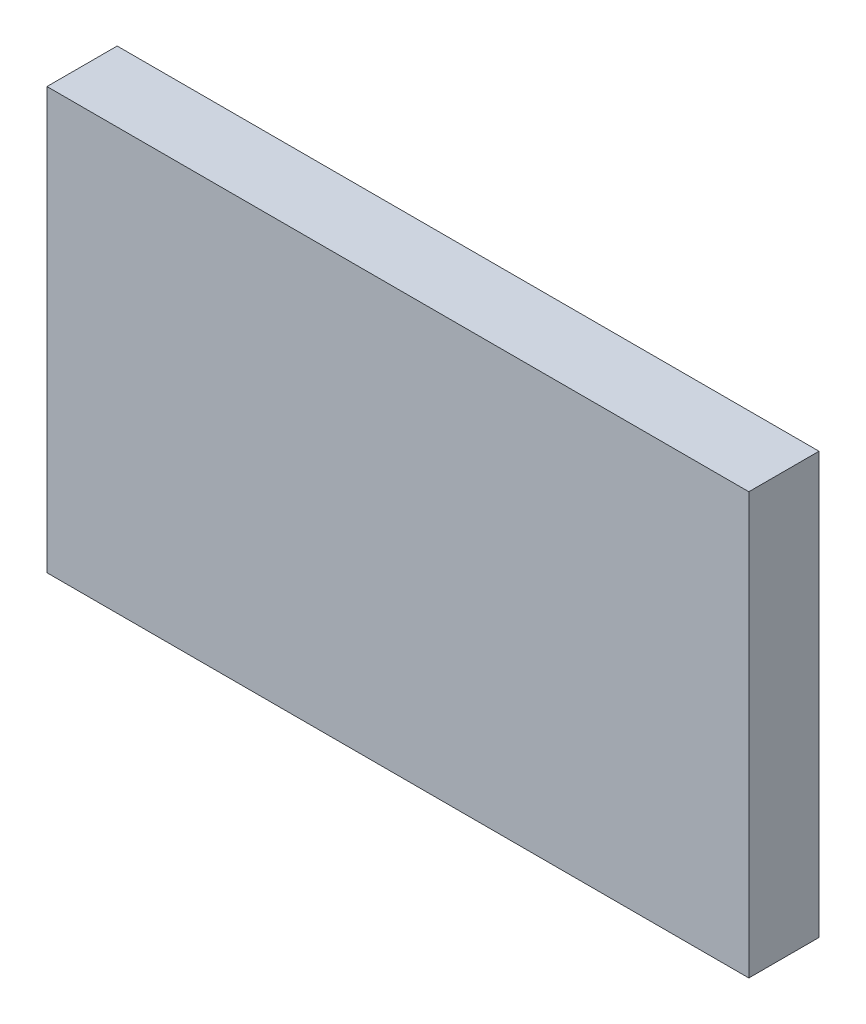
ISO-10303-21;
HEADER;
FILE_DESCRIPTION(('STEP AP214'),'2;1');
FILE_NAME('part.step','',(''),(''),'','','');
FILE_SCHEMA(('AUTOMOTIVE_DESIGN { 1 0 10303 214 1 1 1 1 }'));
ENDSEC;
DATA;
#1=APPLICATION_CONTEXT('core data for automotive mechanical design processes');
#2=APPLICATION_PROTOCOL_DEFINITION('international standard','automotive_design',2000,#1);
#3=PRODUCT_CONTEXT('',#1,'mechanical');
#4=PRODUCT('Part','Part','',(#3));
#5=PRODUCT_RELATED_PRODUCT_CATEGORY('part','',(#4));
#6=PRODUCT_DEFINITION_FORMATION('','',#4);
#7=PRODUCT_DEFINITION_CONTEXT('part definition',#1,'design');
#8=PRODUCT_DEFINITION('design','',#6,#7);
#9=PRODUCT_DEFINITION_SHAPE('','',#8);
#10=(LENGTH_UNIT() NAMED_UNIT(*) SI_UNIT(.MILLI.,.METRE.));
#11=(NAMED_UNIT(*) PLANE_ANGLE_UNIT() SI_UNIT($,.RADIAN.));
#12=(NAMED_UNIT(*) SI_UNIT($,.STERADIAN.) SOLID_ANGLE_UNIT());
#13=UNCERTAINTY_MEASURE_WITH_UNIT(LENGTH_MEASURE(1.E-05),#10,'distance_accuracy_value','');
#14=(GEOMETRIC_REPRESENTATION_CONTEXT(3) GLOBAL_UNCERTAINTY_ASSIGNED_CONTEXT((#13)) GLOBAL_UNIT_ASSIGNED_CONTEXT((#10,
#11,#12)) REPRESENTATION_CONTEXT('',''));
#15=CARTESIAN_POINT('',(0.,0.,0.));
#16=DIRECTION('',(0.,0.,1.));
#17=DIRECTION('',(1.,0.,0.));
#18=AXIS2_PLACEMENT_3D('',#15,#16,#17);
#19=CARTESIAN_POINT('',(-50.,30.,10.));
#20=DIRECTION('',(1.,0.,0.));
#21=DIRECTION('',(0.,0.,-1.));
#22=AXIS2_PLACEMENT_3D('',#19,#20,#21);
#23=PLANE('',#22);
#24=DIRECTION('',(0.,-1.,0.));
#25=VECTOR('',#24,1.);
#26=CARTESIAN_POINT('',(-50.,30.,0.));
#27=LINE('',#26,#25);
#28=CARTESIAN_POINT('',(-50.,30.,0.));
#29=VERTEX_POINT('',#28);
#30=CARTESIAN_POINT('',(-50.,-30.,0.));
#31=VERTEX_POINT('',#30);
#32=EDGE_CURVE('E104',#29,#31,#27,.T.);
#33=ORIENTED_EDGE('',*,*,#32,.T.);
#34=DIRECTION('',(0.,0.,-1.));
#35=VECTOR('',#34,1.);
#36=CARTESIAN_POINT('',(-50.,-30.,10.));
#37=LINE('',#36,#35);
#38=CARTESIAN_POINT('',(-50.,-30.,10.));
#39=VERTEX_POINT('',#38);
#40=EDGE_CURVE('E11',#39,#31,#37,.T.);
#41=ORIENTED_EDGE('',*,*,#40,.F.);
#42=DIRECTION('',(0.,-1.,0.));
#43=VECTOR('',#42,1.);
#44=CARTESIAN_POINT('',(-50.,30.,10.));
#45=LINE('',#44,#43);
#46=CARTESIAN_POINT('',(-50.,30.,10.));
#47=VERTEX_POINT('',#46);
#48=EDGE_CURVE('E92',#47,#39,#45,.T.);
#49=ORIENTED_EDGE('',*,*,#48,.F.);
#50=DIRECTION('',(0.,0.,-1.));
#51=VECTOR('',#50,1.);
#52=CARTESIAN_POINT('',(-50.,30.,10.));
#53=LINE('',#52,#51);
#54=EDGE_CURVE('E100',#47,#29,#53,.T.);
#55=ORIENTED_EDGE('',*,*,#54,.T.);
#56=EDGE_LOOP('',(#33,#41,#49,#55));
#57=FACE_BOUND('',#56,.T.);
#58=ADVANCED_FACE('F41',(#57),#23,.F.);
#59=CARTESIAN_POINT('',(-50.,-30.,10.));
#60=DIRECTION('',(0.,1.,0.));
#61=DIRECTION('',(0.,0.,1.));
#62=AXIS2_PLACEMENT_3D('',#59,#60,#61);
#63=PLANE('',#62);
#64=DIRECTION('',(1.,0.,0.));
#65=VECTOR('',#64,1.);
#66=CARTESIAN_POINT('',(-50.,-30.,0.));
#67=LINE('',#66,#65);
#68=CARTESIAN_POINT('',(50.,-30.,0.));
#69=VERTEX_POINT('',#68);
#70=EDGE_CURVE('E96',#31,#69,#67,.T.);
#71=ORIENTED_EDGE('',*,*,#70,.T.);
#72=DIRECTION('',(0.,0.,-1.));
#73=VECTOR('',#72,1.);
#74=CARTESIAN_POINT('',(50.,-30.,10.));
#75=LINE('',#74,#73);
#76=CARTESIAN_POINT('',(50.,-30.,10.));
#77=VERTEX_POINT('',#76);
#78=EDGE_CURVE('E49',#77,#69,#75,.T.);
#79=ORIENTED_EDGE('',*,*,#78,.F.);
#80=DIRECTION('',(1.,0.,0.));
#81=VECTOR('',#80,1.);
#82=CARTESIAN_POINT('',(-50.,-30.,10.));
#83=LINE('',#82,#81);
#84=EDGE_CURVE('E87',#39,#77,#83,.T.);
#85=ORIENTED_EDGE('',*,*,#84,.F.);
#86=ORIENTED_EDGE('',*,*,#40,.T.);
#87=EDGE_LOOP('',(#71,#79,#85,#86));
#88=FACE_BOUND('',#87,.T.);
#89=ADVANCED_FACE('F95',(#88),#63,.F.);
#90=CARTESIAN_POINT('',(50.,30.,10.));
#91=DIRECTION('',(-1.,0.,0.));
#92=DIRECTION('',(0.,0.,1.));
#93=AXIS2_PLACEMENT_3D('',#90,#91,#92);
#94=PLANE('',#93);
#95=DIRECTION('',(0.,1.,0.));
#96=VECTOR('',#95,1.);
#97=CARTESIAN_POINT('',(50.,30.,0.));
#98=LINE('',#97,#96);
#99=CARTESIAN_POINT('',(50.,30.,0.));
#100=VERTEX_POINT('',#99);
#101=EDGE_CURVE('E74',#69,#100,#98,.T.);
#102=ORIENTED_EDGE('',*,*,#101,.T.);
#103=DIRECTION('',(0.,0.,-1.));
#104=VECTOR('',#103,1.);
#105=CARTESIAN_POINT('',(50.,30.,10.));
#106=LINE('',#105,#104);
#107=CARTESIAN_POINT('',(50.,30.,10.));
#108=VERTEX_POINT('',#107);
#109=EDGE_CURVE('E97',#108,#100,#106,.T.);
#110=ORIENTED_EDGE('',*,*,#109,.F.);
#111=DIRECTION('',(0.,1.,0.));
#112=VECTOR('',#111,1.);
#113=CARTESIAN_POINT('',(50.,30.,10.));
#114=LINE('',#113,#112);
#115=EDGE_CURVE('E90',#77,#108,#114,.T.);
#116=ORIENTED_EDGE('',*,*,#115,.F.);
#117=ORIENTED_EDGE('',*,*,#78,.T.);
#118=EDGE_LOOP('',(#102,#110,#116,#117));
#119=FACE_BOUND('',#118,.T.);
#120=ADVANCED_FACE('F98',(#119),#94,.F.);
#121=CARTESIAN_POINT('',(-50.,30.,10.));
#122=DIRECTION('',(0.,-1.,0.));
#123=DIRECTION('',(0.,0.,-1.));
#124=AXIS2_PLACEMENT_3D('',#121,#122,#123);
#125=PLANE('',#124);
#126=DIRECTION('',(-1.,0.,0.));
#127=VECTOR('',#126,1.);
#128=CARTESIAN_POINT('',(-50.,30.,0.));
#129=LINE('',#128,#127);
#130=EDGE_CURVE('E80',#100,#29,#129,.T.);
#131=ORIENTED_EDGE('',*,*,#130,.T.);
#132=ORIENTED_EDGE('',*,*,#54,.F.);
#133=DIRECTION('',(-1.,0.,0.));
#134=VECTOR('',#133,1.);
#135=CARTESIAN_POINT('',(-50.,30.,10.));
#136=LINE('',#135,#134);
#137=EDGE_CURVE('E57',#108,#47,#136,.T.);
#138=ORIENTED_EDGE('',*,*,#137,.F.);
#139=ORIENTED_EDGE('',*,*,#109,.T.);
#140=EDGE_LOOP('',(#131,#132,#138,#139));
#141=FACE_BOUND('',#140,.T.);
#142=ADVANCED_FACE('F111',(#141),#125,.F.);
#143=CARTESIAN_POINT('',(0.,0.,10.));
#144=DIRECTION('',(0.,0.,1.));
#145=DIRECTION('',(1.,0.,0.));
#146=AXIS2_PLACEMENT_3D('',#143,#144,#145);
#147=PLANE('',#146);
#148=ORIENTED_EDGE('',*,*,#48,.T.);
#149=ORIENTED_EDGE('',*,*,#84,.T.);
#150=ORIENTED_EDGE('',*,*,#115,.T.);
#151=ORIENTED_EDGE('',*,*,#137,.T.);
#152=EDGE_LOOP('',(#148,#149,#150,#151));
#153=FACE_BOUND('',#152,.T.);
#154=ADVANCED_FACE('F88',(#153),#147,.T.);
#155=CARTESIAN_POINT('',(0.,0.,0.));
#156=DIRECTION('',(0.,0.,1.));
#157=DIRECTION('',(1.,0.,0.));
#158=AXIS2_PLACEMENT_3D('',#155,#156,#157);
#159=PLANE('',#158);
#160=ORIENTED_EDGE('',*,*,#32,.F.);
#161=ORIENTED_EDGE('',*,*,#130,.F.);
#162=ORIENTED_EDGE('',*,*,#101,.F.);
#163=ORIENTED_EDGE('',*,*,#70,.F.);
#164=EDGE_LOOP('',(#160,#161,#162,#163));
#165=FACE_BOUND('',#164,.T.);
#166=ADVANCED_FACE('F114',(#165),#159,.F.);
#167=CLOSED_SHELL('',(#58,#89,#120,#142,#154,#166));
#168=MANIFOLD_SOLID_BREP('B2',#167);
#169=ADVANCED_BREP_SHAPE_REPRESENTATION('',(#18,#168),#14);
#170=SHAPE_DEFINITION_REPRESENTATION(#9,#169);
ENDSEC;
END-ISO-10303-21;
